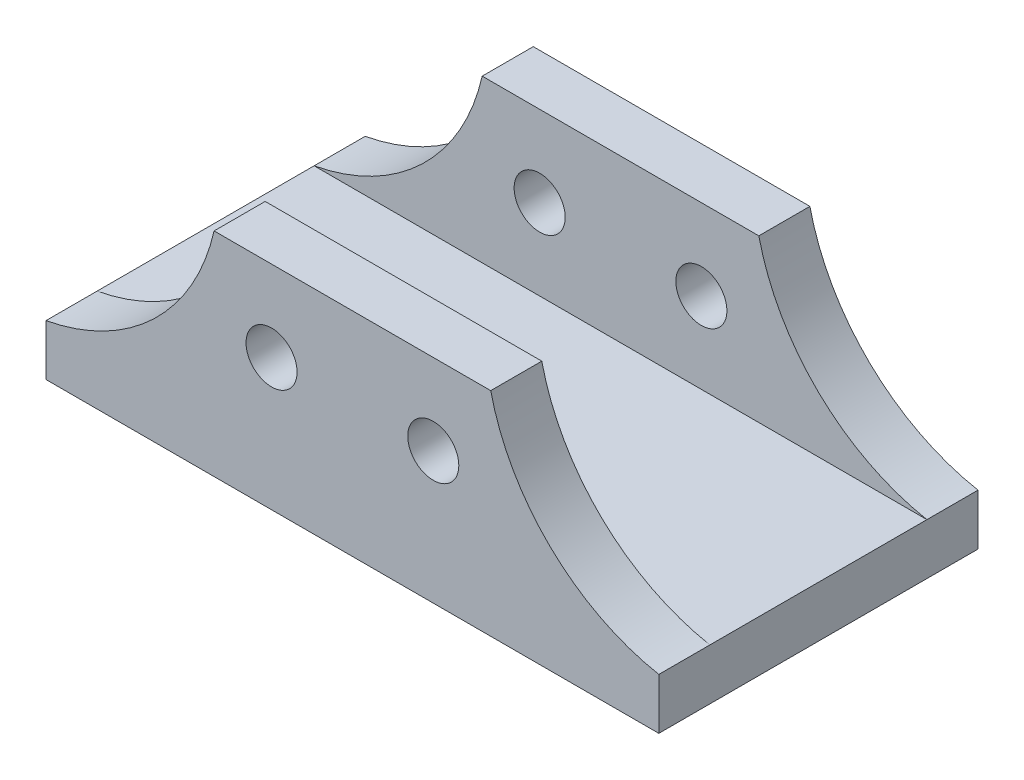
ISO-10303-21;
HEADER;
FILE_DESCRIPTION(('STEP AP214'),'2;1');
FILE_NAME('part.step','',(''),(''),'','','');
FILE_SCHEMA(('AUTOMOTIVE_DESIGN { 1 0 10303 214 1 1 1 1 }'));
ENDSEC;
DATA;
#1=APPLICATION_CONTEXT('core data for automotive mechanical design processes');
#2=APPLICATION_PROTOCOL_DEFINITION('international standard','automotive_design',2000,#1);
#3=PRODUCT_CONTEXT('',#1,'mechanical');
#4=PRODUCT('Part','Part','',(#3));
#5=PRODUCT_RELATED_PRODUCT_CATEGORY('part','',(#4));
#6=PRODUCT_DEFINITION_FORMATION('','',#4);
#7=PRODUCT_DEFINITION_CONTEXT('part definition',#1,'design');
#8=PRODUCT_DEFINITION('design','',#6,#7);
#9=PRODUCT_DEFINITION_SHAPE('','',#8);
#10=(LENGTH_UNIT() NAMED_UNIT(*) SI_UNIT(.MILLI.,.METRE.));
#11=(NAMED_UNIT(*) PLANE_ANGLE_UNIT() SI_UNIT($,.RADIAN.));
#12=(NAMED_UNIT(*) SI_UNIT($,.STERADIAN.) SOLID_ANGLE_UNIT());
#13=UNCERTAINTY_MEASURE_WITH_UNIT(LENGTH_MEASURE(1.E-05),#10,'distance_accuracy_value','');
#14=(GEOMETRIC_REPRESENTATION_CONTEXT(3) GLOBAL_UNCERTAINTY_ASSIGNED_CONTEXT((#13)) GLOBAL_UNIT_ASSIGNED_CONTEXT((#10,
#11,#12)) REPRESENTATION_CONTEXT('',''));
#15=CARTESIAN_POINT('',(0.,0.,0.));
#16=DIRECTION('',(0.,0.,1.));
#17=DIRECTION('',(1.,0.,0.));
#18=AXIS2_PLACEMENT_3D('',#15,#16,#17);
#19=CARTESIAN_POINT('',(81.2436376247931,23.6381233205086,37.5));
#20=DIRECTION('',(0.,0.,-1.));
#21=DIRECTION('',(-1.,0.,0.));
#22=AXIS2_PLACEMENT_3D('',#19,#20,#21);
#23=CYLINDRICAL_SURFACE('',#22,50.);
#24=CARTESIAN_POINT('',(81.2436376247931,23.6381233205086,-25.5));
#25=DIRECTION('',(0.,0.,-1.));
#26=DIRECTION('',(-1.,0.,0.));
#27=AXIS2_PLACEMENT_3D('',#24,#25,#26);
#28=CIRCLE('',#27,50.);
#29=CARTESIAN_POINT('',(72.,-25.5,-25.5));
#30=VERTEX_POINT('',#29);
#31=CARTESIAN_POINT('',(32.5,12.5,-25.5));
#32=VERTEX_POINT('',#31);
#33=EDGE_CURVE('E204',#30,#32,#28,.T.);
#34=ORIENTED_EDGE('',*,*,#33,.F.);
#35=DIRECTION('',(0.,0.,-1.));
#36=VECTOR('',#35,1.);
#37=CARTESIAN_POINT('',(72.,-25.5,37.5));
#38=LINE('',#37,#36);
#39=CARTESIAN_POINT('',(72.,-25.5,-37.5));
#40=VERTEX_POINT('',#39);
#41=EDGE_CURVE('E44',#30,#40,#38,.T.);
#42=ORIENTED_EDGE('',*,*,#41,.T.);
#43=CARTESIAN_POINT('',(81.2436376247931,23.6381233205086,-37.5));
#44=DIRECTION('',(0.,0.,1.));
#45=DIRECTION('',(1.,0.,0.));
#46=AXIS2_PLACEMENT_3D('',#43,#44,#45);
#47=CIRCLE('',#46,50.);
#48=CARTESIAN_POINT('',(32.5,12.5,-37.5));
#49=VERTEX_POINT('',#48);
#50=EDGE_CURVE('E146',#49,#40,#47,.T.);
#51=ORIENTED_EDGE('',*,*,#50,.F.);
#52=DIRECTION('',(0.,0.,-1.));
#53=VECTOR('',#52,1.);
#54=CARTESIAN_POINT('',(32.5,12.5,37.5));
#55=LINE('',#54,#53);
#56=EDGE_CURVE('E171',#32,#49,#55,.T.);
#57=ORIENTED_EDGE('',*,*,#56,.F.);
#58=EDGE_LOOP('',(#34,#42,#51,#57));
#59=FACE_BOUND('',#58,.T.);
#60=ADVANCED_FACE('F35',(#59),#23,.F.);
#61=CARTESIAN_POINT('',(0.,12.5,37.5));
#62=DIRECTION('',(0.,1.,0.));
#63=DIRECTION('',(-1.,0.,0.));
#64=AXIS2_PLACEMENT_3D('',#61,#62,#63);
#65=PLANE('',#64);
#66=DIRECTION('',(-1.,0.,0.));
#67=VECTOR('',#66,1.);
#68=CARTESIAN_POINT('',(-82.1946784223924,12.5,-25.5));
#69=LINE('',#68,#67);
#70=CARTESIAN_POINT('',(-32.5,12.5,-25.5));
#71=VERTEX_POINT('',#70);
#72=EDGE_CURVE('E184',#32,#71,#69,.T.);
#73=ORIENTED_EDGE('',*,*,#72,.F.);
#74=ORIENTED_EDGE('',*,*,#56,.T.);
#75=DIRECTION('',(1.,0.,0.));
#76=VECTOR('',#75,1.);
#77=CARTESIAN_POINT('',(0.,12.5,-37.5));
#78=LINE('',#77,#76);
#79=CARTESIAN_POINT('',(-32.5,12.5,-37.5));
#80=VERTEX_POINT('',#79);
#81=EDGE_CURVE('E150',#80,#49,#78,.T.);
#82=ORIENTED_EDGE('',*,*,#81,.F.);
#83=DIRECTION('',(0.,0.,-1.));
#84=VECTOR('',#83,1.);
#85=CARTESIAN_POINT('',(-32.5,12.5,37.5));
#86=LINE('',#85,#84);
#87=EDGE_CURVE('E126',#71,#80,#86,.T.);
#88=ORIENTED_EDGE('',*,*,#87,.F.);
#89=EDGE_LOOP('',(#73,#74,#82,#88));
#90=FACE_BOUND('',#89,.T.);
#91=ADVANCED_FACE('F246',(#90),#65,.T.);
#92=CARTESIAN_POINT('',(-81.2436376247931,23.6381233205086,37.5));
#93=DIRECTION('',(0.,0.,-1.));
#94=DIRECTION('',(-1.,0.,0.));
#95=AXIS2_PLACEMENT_3D('',#92,#93,#94);
#96=CYLINDRICAL_SURFACE('',#95,50.);
#97=DIRECTION('',(0.,0.,-1.));
#98=VECTOR('',#97,1.);
#99=CARTESIAN_POINT('',(-72.,-25.5,37.5));
#100=LINE('',#99,#98);
#101=CARTESIAN_POINT('',(-72.,-25.5,-25.5));
#102=VERTEX_POINT('',#101);
#103=CARTESIAN_POINT('',(-72.,-25.5,-37.5));
#104=VERTEX_POINT('',#103);
#105=EDGE_CURVE('E129',#102,#104,#100,.T.);
#106=ORIENTED_EDGE('',*,*,#105,.F.);
#107=CARTESIAN_POINT('',(-81.2436376247931,23.6381233205086,-25.5));
#108=DIRECTION('',(0.,0.,-1.));
#109=DIRECTION('',(-1.,0.,0.));
#110=AXIS2_PLACEMENT_3D('',#107,#108,#109);
#111=CIRCLE('',#110,50.);
#112=EDGE_CURVE('E201',#102,#71,#111,.F.);
#113=ORIENTED_EDGE('',*,*,#112,.T.);
#114=ORIENTED_EDGE('',*,*,#87,.T.);
#115=CARTESIAN_POINT('',(-81.2436376247931,23.6381233205086,-37.5));
#116=DIRECTION('',(0.,0.,1.));
#117=DIRECTION('',(1.,0.,0.));
#118=AXIS2_PLACEMENT_3D('',#115,#116,#117);
#119=CIRCLE('',#118,50.);
#120=EDGE_CURVE('E153',#80,#104,#119,.F.);
#121=ORIENTED_EDGE('',*,*,#120,.T.);
#122=EDGE_LOOP('',(#106,#113,#114,#121));
#123=FACE_BOUND('',#122,.T.);
#124=ADVANCED_FACE('F248',(#123),#96,.F.);
#125=CARTESIAN_POINT('',(-19.,-6.5,37.5));
#126=DIRECTION('',(0.,0.,-1.));
#127=DIRECTION('',(-1.,0.,0.));
#128=AXIS2_PLACEMENT_3D('',#125,#126,#127);
#129=CYLINDRICAL_SURFACE('',#128,6.00000000000001);
#130=CARTESIAN_POINT('',(-19.,-6.5,-25.5));
#131=DIRECTION('',(0.,0.,-1.));
#132=DIRECTION('',(-1.,0.,0.));
#133=AXIS2_PLACEMENT_3D('',#130,#131,#132);
#134=CIRCLE('',#133,6.00000000000001);
#135=CARTESIAN_POINT('',(-25.,-6.5,-25.5));
#136=VERTEX_POINT('',#135);
#137=EDGE_CURVE('E198',#136,#136,#134,.F.);
#138=ORIENTED_EDGE('',*,*,#137,.T.);
#139=EDGE_LOOP('',(#138));
#140=FACE_BOUND('',#139,.T.);
#141=CARTESIAN_POINT('',(-19.,-6.5,-37.5));
#142=DIRECTION('',(0.,0.,1.));
#143=DIRECTION('',(1.,0.,0.));
#144=AXIS2_PLACEMENT_3D('',#141,#142,#143);
#145=CIRCLE('',#144,6.00000000000001);
#146=CARTESIAN_POINT('',(-13.,-6.5,-37.5));
#147=VERTEX_POINT('',#146);
#148=EDGE_CURVE('E160',#147,#147,#145,.F.);
#149=ORIENTED_EDGE('',*,*,#148,.T.);
#150=EDGE_LOOP('',(#149));
#151=FACE_BOUND('',#150,.T.);
#152=ADVANCED_FACE('F267',(#140,#151),#129,.F.);
#153=CARTESIAN_POINT('',(19.,-6.5,37.5));
#154=DIRECTION('',(0.,0.,-1.));
#155=DIRECTION('',(-1.,0.,0.));
#156=AXIS2_PLACEMENT_3D('',#153,#154,#155);
#157=CYLINDRICAL_SURFACE('',#156,6.00000000000001);
#158=CARTESIAN_POINT('',(19.,-6.5,-25.5));
#159=DIRECTION('',(0.,0.,-1.));
#160=DIRECTION('',(-1.,0.,0.));
#161=AXIS2_PLACEMENT_3D('',#158,#159,#160);
#162=CIRCLE('',#161,6.00000000000001);
#163=CARTESIAN_POINT('',(13.,-6.5,-25.5));
#164=VERTEX_POINT('',#163);
#165=EDGE_CURVE('E39',#164,#164,#162,.T.);
#166=ORIENTED_EDGE('',*,*,#165,.F.);
#167=EDGE_LOOP('',(#166));
#168=FACE_BOUND('',#167,.T.);
#169=CARTESIAN_POINT('',(19.,-6.5,-37.5));
#170=DIRECTION('',(0.,0.,1.));
#171=DIRECTION('',(1.,0.,0.));
#172=AXIS2_PLACEMENT_3D('',#169,#170,#171);
#173=CIRCLE('',#172,6.00000000000001);
#174=CARTESIAN_POINT('',(25.,-6.5,-37.5));
#175=VERTEX_POINT('',#174);
#176=EDGE_CURVE('E163',#175,#175,#173,.T.);
#177=ORIENTED_EDGE('',*,*,#176,.F.);
#178=EDGE_LOOP('',(#177));
#179=FACE_BOUND('',#178,.T.);
#180=ADVANCED_FACE('F259',(#168,#179),#157,.F.);
#181=CARTESIAN_POINT('',(72.,0.,37.5));
#182=DIRECTION('',(1.,0.,0.));
#183=DIRECTION('',(0.,0.,-1.));
#184=AXIS2_PLACEMENT_3D('',#181,#182,#183);
#185=PLANE('',#184);
#186=DIRECTION('',(0.,-1.,0.));
#187=VECTOR('',#186,1.);
#188=CARTESIAN_POINT('',(72.,0.,-37.5));
#189=LINE('',#188,#187);
#190=CARTESIAN_POINT('',(72.,-37.5,-37.5));
#191=VERTEX_POINT('',#190);
#192=EDGE_CURVE('E143',#40,#191,#189,.T.);
#193=ORIENTED_EDGE('',*,*,#192,.F.);
#194=ORIENTED_EDGE('',*,*,#41,.F.);
#195=DIRECTION('',(0.,0.,-1.));
#196=VECTOR('',#195,1.);
#197=CARTESIAN_POINT('',(72.,-25.5,37.5));
#198=LINE('',#197,#196);
#199=CARTESIAN_POINT('',(72.,-25.5,25.5));
#200=VERTEX_POINT('',#199);
#201=EDGE_CURVE('E147',#30,#200,#198,.F.);
#202=ORIENTED_EDGE('',*,*,#201,.T.);
#203=CARTESIAN_POINT('',(72.,-25.5,37.5));
#204=VERTEX_POINT('',#203);
#205=EDGE_CURVE('E11',#204,#200,#38,.T.);
#206=ORIENTED_EDGE('',*,*,#205,.F.);
#207=DIRECTION('',(0.,-1.,0.));
#208=VECTOR('',#207,1.);
#209=CARTESIAN_POINT('',(72.,0.,37.5));
#210=LINE('',#209,#208);
#211=CARTESIAN_POINT('',(72.,-37.5,37.5));
#212=VERTEX_POINT('',#211);
#213=EDGE_CURVE('E166',#204,#212,#210,.T.);
#214=ORIENTED_EDGE('',*,*,#213,.T.);
#215=DIRECTION('',(0.,0.,-1.));
#216=VECTOR('',#215,1.);
#217=CARTESIAN_POINT('',(72.,-37.5,37.5));
#218=LINE('',#217,#216);
#219=EDGE_CURVE('E88',#212,#191,#218,.T.);
#220=ORIENTED_EDGE('',*,*,#219,.T.);
#221=EDGE_LOOP('',(#193,#194,#202,#206,#214,#220));
#222=FACE_BOUND('',#221,.T.);
#223=ADVANCED_FACE('F37',(#222),#185,.T.);
#224=CARTESIAN_POINT('',(81.2436376247931,23.6381233205086,25.5));
#225=DIRECTION('',(0.,0.,1.));
#226=DIRECTION('',(1.,0.,0.));
#227=AXIS2_PLACEMENT_3D('',#224,#225,#226);
#228=CIRCLE('',#227,50.);
#229=CARTESIAN_POINT('',(32.5,12.5,25.5));
#230=VERTEX_POINT('',#229);
#231=EDGE_CURVE('E195',#230,#200,#228,.T.);
#232=ORIENTED_EDGE('',*,*,#231,.F.);
#233=CARTESIAN_POINT('',(32.5,12.5,37.5));
#234=VERTEX_POINT('',#233);
#235=EDGE_CURVE('E172',#234,#230,#55,.T.);
#236=ORIENTED_EDGE('',*,*,#235,.F.);
#237=CARTESIAN_POINT('',(81.2436376247931,23.6381233205086,37.5));
#238=DIRECTION('',(0.,0.,1.));
#239=DIRECTION('',(1.,0.,0.));
#240=AXIS2_PLACEMENT_3D('',#237,#238,#239);
#241=CIRCLE('',#240,50.);
#242=EDGE_CURVE('E209',#234,#204,#241,.T.);
#243=ORIENTED_EDGE('',*,*,#242,.T.);
#244=ORIENTED_EDGE('',*,*,#205,.T.);
#245=EDGE_LOOP('',(#232,#236,#243,#244));
#246=FACE_BOUND('',#245,.T.);
#247=ADVANCED_FACE('F252',(#246),#23,.F.);
#248=DIRECTION('',(1.,0.,0.));
#249=VECTOR('',#248,1.);
#250=CARTESIAN_POINT('',(-82.1946784223924,12.5,25.5));
#251=LINE('',#250,#249);
#252=CARTESIAN_POINT('',(-32.5,12.5,25.5));
#253=VERTEX_POINT('',#252);
#254=EDGE_CURVE('E188',#253,#230,#251,.T.);
#255=ORIENTED_EDGE('',*,*,#254,.F.);
#256=CARTESIAN_POINT('',(-32.5,12.5,37.5));
#257=VERTEX_POINT('',#256);
#258=EDGE_CURVE('E169',#257,#253,#86,.T.);
#259=ORIENTED_EDGE('',*,*,#258,.F.);
#260=DIRECTION('',(1.,0.,0.));
#261=VECTOR('',#260,1.);
#262=CARTESIAN_POINT('',(0.,12.5,37.5));
#263=LINE('',#262,#261);
#264=EDGE_CURVE('E113',#257,#234,#263,.T.);
#265=ORIENTED_EDGE('',*,*,#264,.T.);
#266=ORIENTED_EDGE('',*,*,#235,.T.);
#267=EDGE_LOOP('',(#255,#259,#265,#266));
#268=FACE_BOUND('',#267,.T.);
#269=ADVANCED_FACE('F213',(#268),#65,.T.);
#270=ORIENTED_EDGE('',*,*,#258,.T.);
#271=CARTESIAN_POINT('',(-81.2436376247931,23.6381233205086,25.5));
#272=DIRECTION('',(0.,0.,1.));
#273=DIRECTION('',(1.,0.,0.));
#274=AXIS2_PLACEMENT_3D('',#271,#272,#273);
#275=CIRCLE('',#274,50.);
#276=CARTESIAN_POINT('',(-72.,-25.5,25.5));
#277=VERTEX_POINT('',#276);
#278=EDGE_CURVE('E123',#253,#277,#275,.F.);
#279=ORIENTED_EDGE('',*,*,#278,.T.);
#280=CARTESIAN_POINT('',(-72.,-25.5,37.5));
#281=VERTEX_POINT('',#280);
#282=EDGE_CURVE('E119',#281,#277,#100,.T.);
#283=ORIENTED_EDGE('',*,*,#282,.F.);
#284=CARTESIAN_POINT('',(-81.2436376247931,23.6381233205086,37.5));
#285=DIRECTION('',(0.,0.,1.));
#286=DIRECTION('',(1.,0.,0.));
#287=AXIS2_PLACEMENT_3D('',#284,#285,#286);
#288=CIRCLE('',#287,50.);
#289=EDGE_CURVE('E104',#257,#281,#288,.F.);
#290=ORIENTED_EDGE('',*,*,#289,.F.);
#291=EDGE_LOOP('',(#270,#279,#283,#290));
#292=FACE_BOUND('',#291,.T.);
#293=ADVANCED_FACE('F120',(#292),#96,.F.);
#294=CARTESIAN_POINT('',(-72.,0.,37.5));
#295=DIRECTION('',(1.,0.,0.));
#296=DIRECTION('',(0.,0.,-1.));
#297=AXIS2_PLACEMENT_3D('',#294,#295,#296);
#298=PLANE('',#297);
#299=DIRECTION('',(0.,-1.,0.));
#300=VECTOR('',#299,1.);
#301=CARTESIAN_POINT('',(-72.,0.,-37.5));
#302=LINE('',#301,#300);
#303=CARTESIAN_POINT('',(-72.,-37.5,-37.5));
#304=VERTEX_POINT('',#303);
#305=EDGE_CURVE('E156',#104,#304,#302,.T.);
#306=ORIENTED_EDGE('',*,*,#305,.T.);
#307=DIRECTION('',(0.,0.,-1.));
#308=VECTOR('',#307,1.);
#309=CARTESIAN_POINT('',(-72.,-37.5,37.5));
#310=LINE('',#309,#308);
#311=CARTESIAN_POINT('',(-72.,-37.5,37.5));
#312=VERTEX_POINT('',#311);
#313=EDGE_CURVE('E132',#312,#304,#310,.T.);
#314=ORIENTED_EDGE('',*,*,#313,.F.);
#315=DIRECTION('',(0.,-1.,0.));
#316=VECTOR('',#315,1.);
#317=CARTESIAN_POINT('',(-72.,0.,37.5));
#318=LINE('',#317,#316);
#319=EDGE_CURVE('E109',#281,#312,#318,.T.);
#320=ORIENTED_EDGE('',*,*,#319,.F.);
#321=ORIENTED_EDGE('',*,*,#282,.T.);
#322=EDGE_CURVE('E127',#277,#102,#100,.T.);
#323=ORIENTED_EDGE('',*,*,#322,.T.);
#324=ORIENTED_EDGE('',*,*,#105,.T.);
#325=EDGE_LOOP('',(#306,#314,#320,#321,#323,#324));
#326=FACE_BOUND('',#325,.T.);
#327=ADVANCED_FACE('F130',(#326),#298,.F.);
#328=CARTESIAN_POINT('',(-19.,-6.5,25.5));
#329=DIRECTION('',(0.,0.,1.));
#330=DIRECTION('',(1.,0.,0.));
#331=AXIS2_PLACEMENT_3D('',#328,#329,#330);
#332=CIRCLE('',#331,6.00000000000001);
#333=CARTESIAN_POINT('',(-13.,-6.5,25.5));
#334=VERTEX_POINT('',#333);
#335=EDGE_CURVE('E176',#334,#334,#332,.F.);
#336=ORIENTED_EDGE('',*,*,#335,.T.);
#337=EDGE_LOOP('',(#336));
#338=FACE_BOUND('',#337,.T.);
#339=CARTESIAN_POINT('',(-19.,-6.5,37.5));
#340=DIRECTION('',(0.,0.,1.));
#341=DIRECTION('',(1.,0.,0.));
#342=AXIS2_PLACEMENT_3D('',#339,#340,#341);
#343=CIRCLE('',#342,6.00000000000001);
#344=CARTESIAN_POINT('',(-13.,-6.5,37.5));
#345=VERTEX_POINT('',#344);
#346=EDGE_CURVE('E134',#345,#345,#343,.F.);
#347=ORIENTED_EDGE('',*,*,#346,.F.);
#348=EDGE_LOOP('',(#347));
#349=FACE_BOUND('',#348,.T.);
#350=ADVANCED_FACE('F273',(#338,#349),#129,.F.);
#351=CARTESIAN_POINT('',(0.,-37.5,37.5));
#352=DIRECTION('',(0.,1.,0.));
#353=DIRECTION('',(0.,0.,1.));
#354=AXIS2_PLACEMENT_3D('',#351,#352,#353);
#355=PLANE('',#354);
#356=CARTESIAN_POINT('',(0.,-37.5,0.));
#357=DIRECTION('',(0.,1.,0.));
#358=DIRECTION('',(-1.,0.,0.));
#359=AXIS2_PLACEMENT_3D('',#356,#357,#358);
#360=CIRCLE('',#359,5.);
#361=CARTESIAN_POINT('',(-5.,-37.5,0.));
#362=VERTEX_POINT('',#361);
#363=EDGE_CURVE('E191',#362,#362,#360,.T.);
#364=ORIENTED_EDGE('',*,*,#363,.T.);
#365=EDGE_LOOP('',(#364));
#366=FACE_BOUND('',#365,.T.);
#367=DIRECTION('',(1.,0.,0.));
#368=VECTOR('',#367,1.);
#369=CARTESIAN_POINT('',(0.,-37.5,-37.5));
#370=LINE('',#369,#368);
#371=EDGE_CURVE('E158',#304,#191,#370,.T.);
#372=ORIENTED_EDGE('',*,*,#371,.T.);
#373=ORIENTED_EDGE('',*,*,#219,.F.);
#374=DIRECTION('',(1.,0.,0.));
#375=VECTOR('',#374,1.);
#376=CARTESIAN_POINT('',(0.,-37.5,37.5));
#377=LINE('',#376,#375);
#378=EDGE_CURVE('E61',#312,#212,#377,.T.);
#379=ORIENTED_EDGE('',*,*,#378,.F.);
#380=ORIENTED_EDGE('',*,*,#313,.T.);
#381=EDGE_LOOP('',(#372,#373,#379,#380));
#382=FACE_BOUND('',#381,.T.);
#383=ADVANCED_FACE('F274',(#366,#382),#355,.F.);
#384=CARTESIAN_POINT('',(19.,-6.5,25.5));
#385=DIRECTION('',(0.,0.,1.));
#386=DIRECTION('',(1.,0.,0.));
#387=AXIS2_PLACEMENT_3D('',#384,#385,#386);
#388=CIRCLE('',#387,6.00000000000001);
#389=CARTESIAN_POINT('',(25.,-6.5,25.5));
#390=VERTEX_POINT('',#389);
#391=EDGE_CURVE('E174',#390,#390,#388,.T.);
#392=ORIENTED_EDGE('',*,*,#391,.F.);
#393=EDGE_LOOP('',(#392));
#394=FACE_BOUND('',#393,.T.);
#395=CARTESIAN_POINT('',(19.,-6.5,37.5));
#396=DIRECTION('',(0.,0.,1.));
#397=DIRECTION('',(1.,0.,0.));
#398=AXIS2_PLACEMENT_3D('',#395,#396,#397);
#399=CIRCLE('',#398,6.00000000000001);
#400=CARTESIAN_POINT('',(25.,-6.5,37.5));
#401=VERTEX_POINT('',#400);
#402=EDGE_CURVE('E140',#401,#401,#399,.T.);
#403=ORIENTED_EDGE('',*,*,#402,.T.);
#404=EDGE_LOOP('',(#403));
#405=FACE_BOUND('',#404,.T.);
#406=ADVANCED_FACE('F277',(#394,#405),#157,.F.);
#407=CARTESIAN_POINT('',(0.,0.,37.5));
#408=DIRECTION('',(0.,0.,1.));
#409=DIRECTION('',(1.,0.,0.));
#410=AXIS2_PLACEMENT_3D('',#407,#408,#409);
#411=PLANE('',#410);
#412=ORIENTED_EDGE('',*,*,#213,.F.);
#413=ORIENTED_EDGE('',*,*,#242,.F.);
#414=ORIENTED_EDGE('',*,*,#264,.F.);
#415=ORIENTED_EDGE('',*,*,#289,.T.);
#416=ORIENTED_EDGE('',*,*,#319,.T.);
#417=ORIENTED_EDGE('',*,*,#378,.T.);
#418=EDGE_LOOP('',(#412,#413,#414,#415,#416,#417));
#419=FACE_BOUND('',#418,.T.);
#420=ORIENTED_EDGE('',*,*,#346,.T.);
#421=EDGE_LOOP('',(#420));
#422=FACE_BOUND('',#421,.T.);
#423=ORIENTED_EDGE('',*,*,#402,.F.);
#424=EDGE_LOOP('',(#423));
#425=FACE_BOUND('',#424,.T.);
#426=ADVANCED_FACE('F106',(#419,#422,#425),#411,.T.);
#427=CARTESIAN_POINT('',(0.,0.,-37.5));
#428=DIRECTION('',(0.,0.,1.));
#429=DIRECTION('',(1.,0.,0.));
#430=AXIS2_PLACEMENT_3D('',#427,#428,#429);
#431=PLANE('',#430);
#432=ORIENTED_EDGE('',*,*,#192,.T.);
#433=ORIENTED_EDGE('',*,*,#371,.F.);
#434=ORIENTED_EDGE('',*,*,#305,.F.);
#435=ORIENTED_EDGE('',*,*,#120,.F.);
#436=ORIENTED_EDGE('',*,*,#81,.T.);
#437=ORIENTED_EDGE('',*,*,#50,.T.);
#438=EDGE_LOOP('',(#432,#433,#434,#435,#436,#437));
#439=FACE_BOUND('',#438,.T.);
#440=ORIENTED_EDGE('',*,*,#148,.F.);
#441=EDGE_LOOP('',(#440));
#442=FACE_BOUND('',#441,.T.);
#443=ORIENTED_EDGE('',*,*,#176,.T.);
#444=EDGE_LOOP('',(#443));
#445=FACE_BOUND('',#444,.T.);
#446=ADVANCED_FACE('F239',(#439,#442,#445),#431,.F.);
#447=CARTESIAN_POINT('',(0.,-25.5,0.));
#448=DIRECTION('',(0.,1.,0.));
#449=DIRECTION('',(-1.,0.,0.));
#450=AXIS2_PLACEMENT_3D('',#447,#448,#449);
#451=PLANE('',#450);
#452=CARTESIAN_POINT('',(0.,-25.5,0.));
#453=DIRECTION('',(0.,1.,0.));
#454=DIRECTION('',(-1.,0.,0.));
#455=AXIS2_PLACEMENT_3D('',#452,#453,#454);
#456=CIRCLE('',#455,5.);
#457=CARTESIAN_POINT('',(-5.,-25.5,0.));
#458=VERTEX_POINT('',#457);
#459=EDGE_CURVE('E306',#458,#458,#456,.T.);
#460=ORIENTED_EDGE('',*,*,#459,.F.);
#461=EDGE_LOOP('',(#460));
#462=FACE_BOUND('',#461,.T.);
#463=DIRECTION('',(-1.,0.,0.));
#464=VECTOR('',#463,1.);
#465=CARTESIAN_POINT('',(-82.1946784223924,-25.5,-25.5));
#466=LINE('',#465,#464);
#467=EDGE_CURVE('E52',#30,#102,#466,.T.);
#468=ORIENTED_EDGE('',*,*,#467,.T.);
#469=ORIENTED_EDGE('',*,*,#322,.F.);
#470=DIRECTION('',(1.,0.,0.));
#471=VECTOR('',#470,1.);
#472=CARTESIAN_POINT('',(-82.1946784223924,-25.5,25.5));
#473=LINE('',#472,#471);
#474=EDGE_CURVE('E181',#277,#200,#473,.T.);
#475=ORIENTED_EDGE('',*,*,#474,.T.);
#476=ORIENTED_EDGE('',*,*,#201,.F.);
#477=EDGE_LOOP('',(#468,#469,#475,#476));
#478=FACE_BOUND('',#477,.T.);
#479=ADVANCED_FACE('F228',(#462,#478),#451,.T.);
#480=CARTESIAN_POINT('',(-82.1946784223924,-25.5,-25.5));
#481=DIRECTION('',(0.,0.,-1.));
#482=DIRECTION('',(-1.,0.,0.));
#483=AXIS2_PLACEMENT_3D('',#480,#481,#482);
#484=PLANE('',#483);
#485=ORIENTED_EDGE('',*,*,#33,.T.);
#486=ORIENTED_EDGE('',*,*,#72,.T.);
#487=ORIENTED_EDGE('',*,*,#112,.F.);
#488=ORIENTED_EDGE('',*,*,#467,.F.);
#489=EDGE_LOOP('',(#485,#486,#487,#488));
#490=FACE_BOUND('',#489,.T.);
#491=ORIENTED_EDGE('',*,*,#165,.T.);
#492=EDGE_LOOP('',(#491));
#493=FACE_BOUND('',#492,.T.);
#494=ORIENTED_EDGE('',*,*,#137,.F.);
#495=EDGE_LOOP('',(#494));
#496=FACE_BOUND('',#495,.T.);
#497=ADVANCED_FACE('F231',(#490,#493,#496),#484,.F.);
#498=CARTESIAN_POINT('',(-82.1946784223924,-25.5,25.5));
#499=DIRECTION('',(0.,0.,1.));
#500=DIRECTION('',(1.,0.,0.));
#501=AXIS2_PLACEMENT_3D('',#498,#499,#500);
#502=PLANE('',#501);
#503=ORIENTED_EDGE('',*,*,#231,.T.);
#504=ORIENTED_EDGE('',*,*,#474,.F.);
#505=ORIENTED_EDGE('',*,*,#278,.F.);
#506=ORIENTED_EDGE('',*,*,#254,.T.);
#507=EDGE_LOOP('',(#503,#504,#505,#506));
#508=FACE_BOUND('',#507,.T.);
#509=ORIENTED_EDGE('',*,*,#391,.T.);
#510=EDGE_LOOP('',(#509));
#511=FACE_BOUND('',#510,.T.);
#512=ORIENTED_EDGE('',*,*,#335,.F.);
#513=EDGE_LOOP('',(#512));
#514=FACE_BOUND('',#513,.T.);
#515=ADVANCED_FACE('F249',(#508,#511,#514),#502,.F.);
#516=CARTESIAN_POINT('',(0.,-37.5,0.));
#517=DIRECTION('',(0.,1.,0.));
#518=DIRECTION('',(-1.,0.,0.));
#519=AXIS2_PLACEMENT_3D('',#516,#517,#518);
#520=CYLINDRICAL_SURFACE('',#519,5.);
#521=ORIENTED_EDGE('',*,*,#363,.F.);
#522=EDGE_LOOP('',(#521));
#523=FACE_BOUND('',#522,.T.);
#524=ORIENTED_EDGE('',*,*,#459,.T.);
#525=EDGE_LOOP('',(#524));
#526=FACE_BOUND('',#525,.T.);
#527=ADVANCED_FACE('F291',(#523,#526),#520,.F.);
#528=CLOSED_SHELL('',(#60,#91,#124,#152,#180,#223,#247,#269,#293,#327,#350,#383,#406,#426,#446,
#479,#497,#515,#527));
#529=MANIFOLD_SOLID_BREP('B2',#528);
#530=ADVANCED_BREP_SHAPE_REPRESENTATION('',(#18,#529),#14);
#531=SHAPE_DEFINITION_REPRESENTATION(#9,#530);
ENDSEC;
END-ISO-10303-21;
